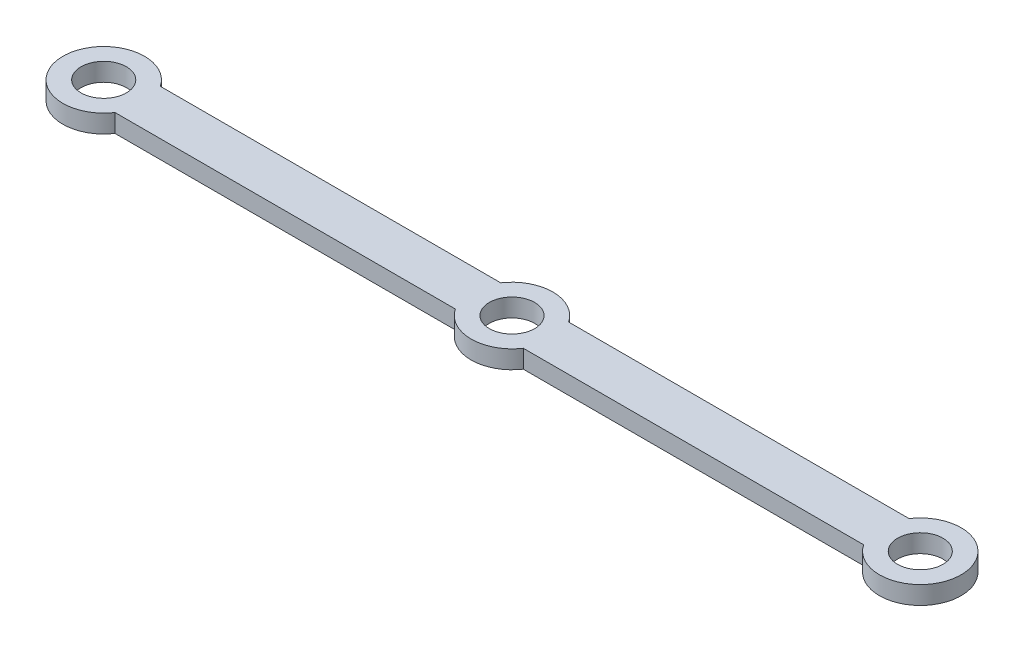
ISO-10303-21;
HEADER;
FILE_DESCRIPTION(('STEP AP214'),'2;1');
FILE_NAME('part.step','',(''),(''),'','','');
FILE_SCHEMA(('AUTOMOTIVE_DESIGN { 1 0 10303 214 1 1 1 1 }'));
ENDSEC;
DATA;
#1=APPLICATION_CONTEXT('core data for automotive mechanical design processes');
#2=APPLICATION_PROTOCOL_DEFINITION('international standard','automotive_design',2000,#1);
#3=PRODUCT_CONTEXT('',#1,'mechanical');
#4=PRODUCT('Part','Part','',(#3));
#5=PRODUCT_RELATED_PRODUCT_CATEGORY('part','',(#4));
#6=PRODUCT_DEFINITION_FORMATION('','',#4);
#7=PRODUCT_DEFINITION_CONTEXT('part definition',#1,'design');
#8=PRODUCT_DEFINITION('design','',#6,#7);
#9=PRODUCT_DEFINITION_SHAPE('','',#8);
#10=(LENGTH_UNIT() NAMED_UNIT(*) SI_UNIT(.MILLI.,.METRE.));
#11=(NAMED_UNIT(*) PLANE_ANGLE_UNIT() SI_UNIT($,.RADIAN.));
#12=(NAMED_UNIT(*) SI_UNIT($,.STERADIAN.) SOLID_ANGLE_UNIT());
#13=UNCERTAINTY_MEASURE_WITH_UNIT(LENGTH_MEASURE(1.E-05),#10,'distance_accuracy_value','');
#14=(GEOMETRIC_REPRESENTATION_CONTEXT(3) GLOBAL_UNCERTAINTY_ASSIGNED_CONTEXT((#13)) GLOBAL_UNIT_ASSIGNED_CONTEXT((#10,
#11,#12)) REPRESENTATION_CONTEXT('',''));
#15=CARTESIAN_POINT('',(0.,0.,0.));
#16=DIRECTION('',(0.,0.,1.));
#17=DIRECTION('',(1.,0.,0.));
#18=AXIS2_PLACEMENT_3D('',#15,#16,#17);
#19=CARTESIAN_POINT('',(90.,2.,0.));
#20=DIRECTION('',(0.,-1.,0.));
#21=DIRECTION('',(0.,0.,-1.));
#22=AXIS2_PLACEMENT_3D('',#19,#20,#21);
#23=CYLINDRICAL_SURFACE('',#22,4.5);
#24=CARTESIAN_POINT('',(90.,0.,0.));
#25=DIRECTION('',(0.,1.,0.));
#26=DIRECTION('',(0.,0.,1.));
#27=AXIS2_PLACEMENT_3D('',#24,#25,#26);
#28=CIRCLE('',#27,4.5);
#29=CARTESIAN_POINT('',(86.258342613226,0.,2.49999999999999));
#30=VERTEX_POINT('',#29);
#31=CARTESIAN_POINT('',(86.258342613226,0.,-2.50000000000002));
#32=VERTEX_POINT('',#31);
#33=EDGE_CURVE('E150',#30,#32,#28,.T.);
#34=ORIENTED_EDGE('',*,*,#33,.T.);
#35=DIRECTION('',(0.,-1.,0.));
#36=VECTOR('',#35,1.);
#37=CARTESIAN_POINT('',(86.258342613226,2.,-2.50000000000002));
#38=LINE('',#37,#36);
#39=CARTESIAN_POINT('',(86.258342613226,2.,-2.50000000000002));
#40=VERTEX_POINT('',#39);
#41=EDGE_CURVE('E11',#40,#32,#38,.T.);
#42=ORIENTED_EDGE('',*,*,#41,.F.);
#43=CARTESIAN_POINT('',(90.,2.,0.));
#44=DIRECTION('',(0.,1.,0.));
#45=DIRECTION('',(0.,0.,1.));
#46=AXIS2_PLACEMENT_3D('',#43,#44,#45);
#47=CIRCLE('',#46,4.5);
#48=CARTESIAN_POINT('',(86.258342613226,2.,2.49999999999999));
#49=VERTEX_POINT('',#48);
#50=EDGE_CURVE('E100',#49,#40,#47,.T.);
#51=ORIENTED_EDGE('',*,*,#50,.F.);
#52=DIRECTION('',(0.,-1.,0.));
#53=VECTOR('',#52,1.);
#54=CARTESIAN_POINT('',(86.258342613226,2.,2.49999999999999));
#55=LINE('',#54,#53);
#56=EDGE_CURVE('E147',#49,#30,#55,.T.);
#57=ORIENTED_EDGE('',*,*,#56,.T.);
#58=EDGE_LOOP('',(#34,#42,#51,#57));
#59=FACE_BOUND('',#58,.T.);
#60=ADVANCED_FACE('F41',(#59),#23,.T.);
#61=CARTESIAN_POINT('',(0.,2.,-2.5));
#62=DIRECTION('',(0.,0.,-1.));
#63=DIRECTION('',(-1.,0.,0.));
#64=AXIS2_PLACEMENT_3D('',#61,#62,#63);
#65=PLANE('',#64);
#66=DIRECTION('',(1.,0.,0.));
#67=VECTOR('',#66,1.);
#68=CARTESIAN_POINT('',(0.,0.,-2.5));
#69=LINE('',#68,#67);
#70=CARTESIAN_POINT('',(48.7416573867739,0.,-2.50000000000001));
#71=VERTEX_POINT('',#70);
#72=EDGE_CURVE('E148',#71,#32,#69,.T.);
#73=ORIENTED_EDGE('',*,*,#72,.F.);
#74=DIRECTION('',(0.,-1.,0.));
#75=VECTOR('',#74,1.);
#76=CARTESIAN_POINT('',(48.7416573867739,2.,-2.50000000000001));
#77=LINE('',#76,#75);
#78=CARTESIAN_POINT('',(48.7416573867739,2.,-2.50000000000001));
#79=VERTEX_POINT('',#78);
#80=EDGE_CURVE('E47',#79,#71,#77,.T.);
#81=ORIENTED_EDGE('',*,*,#80,.F.);
#82=DIRECTION('',(1.,0.,0.));
#83=VECTOR('',#82,1.);
#84=CARTESIAN_POINT('',(0.,2.,-2.5));
#85=LINE('',#84,#83);
#86=EDGE_CURVE('E193',#79,#40,#85,.T.);
#87=ORIENTED_EDGE('',*,*,#86,.T.);
#88=ORIENTED_EDGE('',*,*,#41,.T.);
#89=EDGE_LOOP('',(#73,#81,#87,#88));
#90=FACE_BOUND('',#89,.T.);
#91=ADVANCED_FACE('F191',(#90),#65,.T.);
#92=CARTESIAN_POINT('',(45.,2.,0.));
#93=DIRECTION('',(0.,-1.,0.));
#94=DIRECTION('',(0.,0.,-1.));
#95=AXIS2_PLACEMENT_3D('',#92,#93,#94);
#96=CYLINDRICAL_SURFACE('',#95,4.5);
#97=CARTESIAN_POINT('',(45.,0.,0.));
#98=DIRECTION('',(0.,1.,0.));
#99=DIRECTION('',(0.,0.,1.));
#100=AXIS2_PLACEMENT_3D('',#97,#98,#99);
#101=CIRCLE('',#100,4.5);
#102=CARTESIAN_POINT('',(41.2583426132261,0.,-2.50000000000001));
#103=VERTEX_POINT('',#102);
#104=EDGE_CURVE('E154',#71,#103,#101,.T.);
#105=ORIENTED_EDGE('',*,*,#104,.T.);
#106=DIRECTION('',(0.,-1.,0.));
#107=VECTOR('',#106,1.);
#108=CARTESIAN_POINT('',(41.2583426132261,2.,-2.50000000000001));
#109=LINE('',#108,#107);
#110=CARTESIAN_POINT('',(41.2583426132261,2.,-2.50000000000001));
#111=VERTEX_POINT('',#110);
#112=EDGE_CURVE('E178',#111,#103,#109,.T.);
#113=ORIENTED_EDGE('',*,*,#112,.F.);
#114=CARTESIAN_POINT('',(45.,2.,0.));
#115=DIRECTION('',(0.,1.,0.));
#116=DIRECTION('',(0.,0.,1.));
#117=AXIS2_PLACEMENT_3D('',#114,#115,#116);
#118=CIRCLE('',#117,4.5);
#119=EDGE_CURVE('E182',#79,#111,#118,.T.);
#120=ORIENTED_EDGE('',*,*,#119,.F.);
#121=ORIENTED_EDGE('',*,*,#80,.T.);
#122=EDGE_LOOP('',(#105,#113,#120,#121));
#123=FACE_BOUND('',#122,.T.);
#124=ADVANCED_FACE('F185',(#123),#96,.T.);
#125=CARTESIAN_POINT('',(0.,2.,-2.5));
#126=DIRECTION('',(0.,0.,-1.));
#127=DIRECTION('',(-1.,0.,0.));
#128=AXIS2_PLACEMENT_3D('',#125,#126,#127);
#129=PLANE('',#128);
#130=DIRECTION('',(1.,0.,0.));
#131=VECTOR('',#130,1.);
#132=CARTESIAN_POINT('',(0.,0.,-2.5));
#133=LINE('',#132,#131);
#134=CARTESIAN_POINT('',(3.74165738677394,0.,-2.5));
#135=VERTEX_POINT('',#134);
#136=EDGE_CURVE('E157',#135,#103,#133,.T.);
#137=ORIENTED_EDGE('',*,*,#136,.F.);
#138=DIRECTION('',(0.,-1.,0.));
#139=VECTOR('',#138,1.);
#140=CARTESIAN_POINT('',(3.74165738677394,2.,-2.5));
#141=LINE('',#140,#139);
#142=CARTESIAN_POINT('',(3.74165738677394,2.,-2.5));
#143=VERTEX_POINT('',#142);
#144=EDGE_CURVE('E176',#143,#135,#141,.T.);
#145=ORIENTED_EDGE('',*,*,#144,.F.);
#146=DIRECTION('',(1.,0.,0.));
#147=VECTOR('',#146,1.);
#148=CARTESIAN_POINT('',(0.,2.,-2.5));
#149=LINE('',#148,#147);
#150=EDGE_CURVE('E202',#143,#111,#149,.T.);
#151=ORIENTED_EDGE('',*,*,#150,.T.);
#152=ORIENTED_EDGE('',*,*,#112,.T.);
#153=EDGE_LOOP('',(#137,#145,#151,#152));
#154=FACE_BOUND('',#153,.T.);
#155=ADVANCED_FACE('F198',(#154),#129,.T.);
#156=CARTESIAN_POINT('',(0.,2.,0.));
#157=DIRECTION('',(0.,-1.,0.));
#158=DIRECTION('',(0.,0.,-1.));
#159=AXIS2_PLACEMENT_3D('',#156,#157,#158);
#160=CYLINDRICAL_SURFACE('',#159,4.5);
#161=CARTESIAN_POINT('',(0.,0.,0.));
#162=DIRECTION('',(0.,1.,0.));
#163=DIRECTION('',(0.,0.,1.));
#164=AXIS2_PLACEMENT_3D('',#161,#162,#163);
#165=CIRCLE('',#164,4.5);
#166=CARTESIAN_POINT('',(3.74165738677394,0.,2.5));
#167=VERTEX_POINT('',#166);
#168=EDGE_CURVE('E159',#135,#167,#165,.T.);
#169=ORIENTED_EDGE('',*,*,#168,.T.);
#170=DIRECTION('',(0.,-1.,0.));
#171=VECTOR('',#170,1.);
#172=CARTESIAN_POINT('',(3.74165738677394,2.,2.5));
#173=LINE('',#172,#171);
#174=CARTESIAN_POINT('',(3.74165738677394,2.,2.5));
#175=VERTEX_POINT('',#174);
#176=EDGE_CURVE('E129',#175,#167,#173,.T.);
#177=ORIENTED_EDGE('',*,*,#176,.F.);
#178=CARTESIAN_POINT('',(0.,2.,0.));
#179=DIRECTION('',(0.,1.,0.));
#180=DIRECTION('',(0.,0.,1.));
#181=AXIS2_PLACEMENT_3D('',#178,#179,#180);
#182=CIRCLE('',#181,4.5);
#183=EDGE_CURVE('E120',#143,#175,#182,.T.);
#184=ORIENTED_EDGE('',*,*,#183,.F.);
#185=ORIENTED_EDGE('',*,*,#144,.T.);
#186=EDGE_LOOP('',(#169,#177,#184,#185));
#187=FACE_BOUND('',#186,.T.);
#188=ADVANCED_FACE('F206',(#187),#160,.T.);
#189=CARTESIAN_POINT('',(0.,2.,2.5));
#190=DIRECTION('',(0.,0.,-1.));
#191=DIRECTION('',(-1.,0.,0.));
#192=AXIS2_PLACEMENT_3D('',#189,#190,#191);
#193=PLANE('',#192);
#194=DIRECTION('',(1.,0.,0.));
#195=VECTOR('',#194,1.);
#196=CARTESIAN_POINT('',(0.,0.,2.5));
#197=LINE('',#196,#195);
#198=CARTESIAN_POINT('',(41.258342613226,0.,2.49999999999999));
#199=VERTEX_POINT('',#198);
#200=EDGE_CURVE('E126',#167,#199,#197,.T.);
#201=ORIENTED_EDGE('',*,*,#200,.T.);
#202=DIRECTION('',(0.,-1.,0.));
#203=VECTOR('',#202,1.);
#204=CARTESIAN_POINT('',(41.258342613226,2.,2.49999999999999));
#205=LINE('',#204,#203);
#206=CARTESIAN_POINT('',(41.258342613226,2.,2.49999999999999));
#207=VERTEX_POINT('',#206);
#208=EDGE_CURVE('E124',#207,#199,#205,.T.);
#209=ORIENTED_EDGE('',*,*,#208,.F.);
#210=DIRECTION('',(1.,0.,0.));
#211=VECTOR('',#210,1.);
#212=CARTESIAN_POINT('',(0.,2.,2.5));
#213=LINE('',#212,#211);
#214=EDGE_CURVE('E115',#175,#207,#213,.T.);
#215=ORIENTED_EDGE('',*,*,#214,.F.);
#216=ORIENTED_EDGE('',*,*,#176,.T.);
#217=EDGE_LOOP('',(#201,#209,#215,#216));
#218=FACE_BOUND('',#217,.T.);
#219=ADVANCED_FACE('F128',(#218),#193,.F.);
#220=CARTESIAN_POINT('',(45.,2.,0.));
#221=DIRECTION('',(0.,-1.,0.));
#222=DIRECTION('',(0.,0.,-1.));
#223=AXIS2_PLACEMENT_3D('',#220,#221,#222);
#224=CYLINDRICAL_SURFACE('',#223,4.5);
#225=CARTESIAN_POINT('',(45.,0.,0.));
#226=DIRECTION('',(0.,1.,0.));
#227=DIRECTION('',(0.,0.,1.));
#228=AXIS2_PLACEMENT_3D('',#225,#226,#227);
#229=CIRCLE('',#228,4.5);
#230=CARTESIAN_POINT('',(48.741657386774,0.,2.49999999999999));
#231=VERTEX_POINT('',#230);
#232=EDGE_CURVE('E82',#199,#231,#229,.T.);
#233=ORIENTED_EDGE('',*,*,#232,.T.);
#234=DIRECTION('',(0.,-1.,0.));
#235=VECTOR('',#234,1.);
#236=CARTESIAN_POINT('',(48.741657386774,2.,2.49999999999999));
#237=LINE('',#236,#235);
#238=CARTESIAN_POINT('',(48.741657386774,2.,2.49999999999999));
#239=VERTEX_POINT('',#238);
#240=EDGE_CURVE('E127',#239,#231,#237,.T.);
#241=ORIENTED_EDGE('',*,*,#240,.F.);
#242=CARTESIAN_POINT('',(45.,2.,0.));
#243=DIRECTION('',(0.,1.,0.));
#244=DIRECTION('',(0.,0.,1.));
#245=AXIS2_PLACEMENT_3D('',#242,#243,#244);
#246=CIRCLE('',#245,4.5);
#247=EDGE_CURVE('E117',#207,#239,#246,.T.);
#248=ORIENTED_EDGE('',*,*,#247,.F.);
#249=ORIENTED_EDGE('',*,*,#208,.T.);
#250=EDGE_LOOP('',(#233,#241,#248,#249));
#251=FACE_BOUND('',#250,.T.);
#252=ADVANCED_FACE('F135',(#251),#224,.T.);
#253=CARTESIAN_POINT('',(0.,2.,0.));
#254=DIRECTION('',(0.,-1.,0.));
#255=DIRECTION('',(0.,0.,-1.));
#256=AXIS2_PLACEMENT_3D('',#253,#254,#255);
#257=CYLINDRICAL_SURFACE('',#256,2.5);
#258=CARTESIAN_POINT('',(0.,2.,0.));
#259=DIRECTION('',(0.,1.,0.));
#260=DIRECTION('',(0.,0.,1.));
#261=AXIS2_PLACEMENT_3D('',#258,#259,#260);
#262=CIRCLE('',#261,2.5);
#263=CARTESIAN_POINT('',(0.,2.,2.5));
#264=VERTEX_POINT('',#263);
#265=EDGE_CURVE('E139',#264,#264,#262,.T.);
#266=ORIENTED_EDGE('',*,*,#265,.T.);
#267=EDGE_LOOP('',(#266));
#268=FACE_BOUND('',#267,.T.);
#269=CARTESIAN_POINT('',(0.,0.,0.));
#270=DIRECTION('',(0.,1.,0.));
#271=DIRECTION('',(0.,0.,1.));
#272=AXIS2_PLACEMENT_3D('',#269,#270,#271);
#273=CIRCLE('',#272,2.5);
#274=CARTESIAN_POINT('',(0.,0.,2.5));
#275=VERTEX_POINT('',#274);
#276=EDGE_CURVE('E167',#275,#275,#273,.T.);
#277=ORIENTED_EDGE('',*,*,#276,.F.);
#278=EDGE_LOOP('',(#277));
#279=FACE_BOUND('',#278,.T.);
#280=ADVANCED_FACE('F248',(#268,#279),#257,.F.);
#281=CARTESIAN_POINT('',(45.,2.,0.));
#282=DIRECTION('',(0.,-1.,0.));
#283=DIRECTION('',(0.,0.,-1.));
#284=AXIS2_PLACEMENT_3D('',#281,#282,#283);
#285=CYLINDRICAL_SURFACE('',#284,2.5);
#286=CARTESIAN_POINT('',(45.,2.,0.));
#287=DIRECTION('',(0.,1.,0.));
#288=DIRECTION('',(0.,0.,1.));
#289=AXIS2_PLACEMENT_3D('',#286,#287,#288);
#290=CIRCLE('',#289,2.5);
#291=CARTESIAN_POINT('',(45.,2.,2.5));
#292=VERTEX_POINT('',#291);
#293=EDGE_CURVE('E132',#292,#292,#290,.T.);
#294=ORIENTED_EDGE('',*,*,#293,.T.);
#295=EDGE_LOOP('',(#294));
#296=FACE_BOUND('',#295,.T.);
#297=CARTESIAN_POINT('',(45.,0.,0.));
#298=DIRECTION('',(0.,1.,0.));
#299=DIRECTION('',(0.,0.,1.));
#300=AXIS2_PLACEMENT_3D('',#297,#298,#299);
#301=CIRCLE('',#300,2.5);
#302=CARTESIAN_POINT('',(45.,0.,2.5));
#303=VERTEX_POINT('',#302);
#304=EDGE_CURVE('E163',#303,#303,#301,.T.);
#305=ORIENTED_EDGE('',*,*,#304,.F.);
#306=EDGE_LOOP('',(#305));
#307=FACE_BOUND('',#306,.T.);
#308=ADVANCED_FACE('F260',(#296,#307),#285,.F.);
#309=CARTESIAN_POINT('',(0.,2.,2.5));
#310=DIRECTION('',(0.,0.,-1.));
#311=DIRECTION('',(-1.,0.,0.));
#312=AXIS2_PLACEMENT_3D('',#309,#310,#311);
#313=PLANE('',#312);
#314=DIRECTION('',(1.,0.,0.));
#315=VECTOR('',#314,1.);
#316=CARTESIAN_POINT('',(0.,0.,2.5));
#317=LINE('',#316,#315);
#318=EDGE_CURVE('E91',#231,#30,#317,.T.);
#319=ORIENTED_EDGE('',*,*,#318,.T.);
#320=ORIENTED_EDGE('',*,*,#56,.F.);
#321=DIRECTION('',(1.,0.,0.));
#322=VECTOR('',#321,1.);
#323=CARTESIAN_POINT('',(0.,2.,2.5));
#324=LINE('',#323,#322);
#325=EDGE_CURVE('E60',#239,#49,#324,.T.);
#326=ORIENTED_EDGE('',*,*,#325,.F.);
#327=ORIENTED_EDGE('',*,*,#240,.T.);
#328=EDGE_LOOP('',(#319,#320,#326,#327));
#329=FACE_BOUND('',#328,.T.);
#330=ADVANCED_FACE('F267',(#329),#313,.F.);
#331=CARTESIAN_POINT('',(90.,2.,0.));
#332=DIRECTION('',(0.,-1.,0.));
#333=DIRECTION('',(0.,0.,-1.));
#334=AXIS2_PLACEMENT_3D('',#331,#332,#333);
#335=CYLINDRICAL_SURFACE('',#334,2.5);
#336=CARTESIAN_POINT('',(90.,2.,0.));
#337=DIRECTION('',(0.,1.,0.));
#338=DIRECTION('',(0.,0.,1.));
#339=AXIS2_PLACEMENT_3D('',#336,#337,#338);
#340=CIRCLE('',#339,2.5);
#341=CARTESIAN_POINT('',(90.,2.,2.49999999999998));
#342=VERTEX_POINT('',#341);
#343=EDGE_CURVE('E142',#342,#342,#340,.T.);
#344=ORIENTED_EDGE('',*,*,#343,.T.);
#345=EDGE_LOOP('',(#344));
#346=FACE_BOUND('',#345,.T.);
#347=CARTESIAN_POINT('',(90.,0.,0.));
#348=DIRECTION('',(0.,1.,0.));
#349=DIRECTION('',(0.,0.,1.));
#350=AXIS2_PLACEMENT_3D('',#347,#348,#349);
#351=CIRCLE('',#350,2.5);
#352=CARTESIAN_POINT('',(90.,0.,2.49999999999998));
#353=VERTEX_POINT('',#352);
#354=EDGE_CURVE('E169',#353,#353,#351,.T.);
#355=ORIENTED_EDGE('',*,*,#354,.F.);
#356=EDGE_LOOP('',(#355));
#357=FACE_BOUND('',#356,.T.);
#358=ADVANCED_FACE('F278',(#346,#357),#335,.F.);
#359=CARTESIAN_POINT('',(0.,2.,0.));
#360=DIRECTION('',(0.,1.,0.));
#361=DIRECTION('',(0.,0.,1.));
#362=AXIS2_PLACEMENT_3D('',#359,#360,#361);
#363=PLANE('',#362);
#364=ORIENTED_EDGE('',*,*,#50,.T.);
#365=ORIENTED_EDGE('',*,*,#86,.F.);
#366=ORIENTED_EDGE('',*,*,#119,.T.);
#367=ORIENTED_EDGE('',*,*,#150,.F.);
#368=ORIENTED_EDGE('',*,*,#183,.T.);
#369=ORIENTED_EDGE('',*,*,#214,.T.);
#370=ORIENTED_EDGE('',*,*,#247,.T.);
#371=ORIENTED_EDGE('',*,*,#325,.T.);
#372=EDGE_LOOP('',(#364,#365,#366,#367,#368,#369,#370,#371));
#373=FACE_BOUND('',#372,.T.);
#374=ORIENTED_EDGE('',*,*,#293,.F.);
#375=EDGE_LOOP('',(#374));
#376=FACE_BOUND('',#375,.T.);
#377=ORIENTED_EDGE('',*,*,#265,.F.);
#378=EDGE_LOOP('',(#377));
#379=FACE_BOUND('',#378,.T.);
#380=ORIENTED_EDGE('',*,*,#343,.F.);
#381=EDGE_LOOP('',(#380));
#382=FACE_BOUND('',#381,.T.);
#383=ADVANCED_FACE('F114',(#373,#376,#379,#382),#363,.T.);
#384=CARTESIAN_POINT('',(0.,0.,0.));
#385=DIRECTION('',(0.,1.,0.));
#386=DIRECTION('',(0.,0.,1.));
#387=AXIS2_PLACEMENT_3D('',#384,#385,#386);
#388=PLANE('',#387);
#389=ORIENTED_EDGE('',*,*,#33,.F.);
#390=ORIENTED_EDGE('',*,*,#318,.F.);
#391=ORIENTED_EDGE('',*,*,#232,.F.);
#392=ORIENTED_EDGE('',*,*,#200,.F.);
#393=ORIENTED_EDGE('',*,*,#168,.F.);
#394=ORIENTED_EDGE('',*,*,#136,.T.);
#395=ORIENTED_EDGE('',*,*,#104,.F.);
#396=ORIENTED_EDGE('',*,*,#72,.T.);
#397=EDGE_LOOP('',(#389,#390,#391,#392,#393,#394,#395,#396));
#398=FACE_BOUND('',#397,.T.);
#399=ORIENTED_EDGE('',*,*,#304,.T.);
#400=EDGE_LOOP('',(#399));
#401=FACE_BOUND('',#400,.T.);
#402=ORIENTED_EDGE('',*,*,#276,.T.);
#403=EDGE_LOOP('',(#402));
#404=FACE_BOUND('',#403,.T.);
#405=ORIENTED_EDGE('',*,*,#354,.T.);
#406=EDGE_LOOP('',(#405));
#407=FACE_BOUND('',#406,.T.);
#408=ADVANCED_FACE('F189',(#398,#401,#404,#407),#388,.F.);
#409=CLOSED_SHELL('',(#60,#91,#124,#155,#188,#219,#252,#280,#308,#330,#358,#383,#408));
#410=MANIFOLD_SOLID_BREP('B2',#409);
#411=ADVANCED_BREP_SHAPE_REPRESENTATION('',(#18,#410),#14);
#412=SHAPE_DEFINITION_REPRESENTATION(#9,#411);
ENDSEC;
END-ISO-10303-21;
